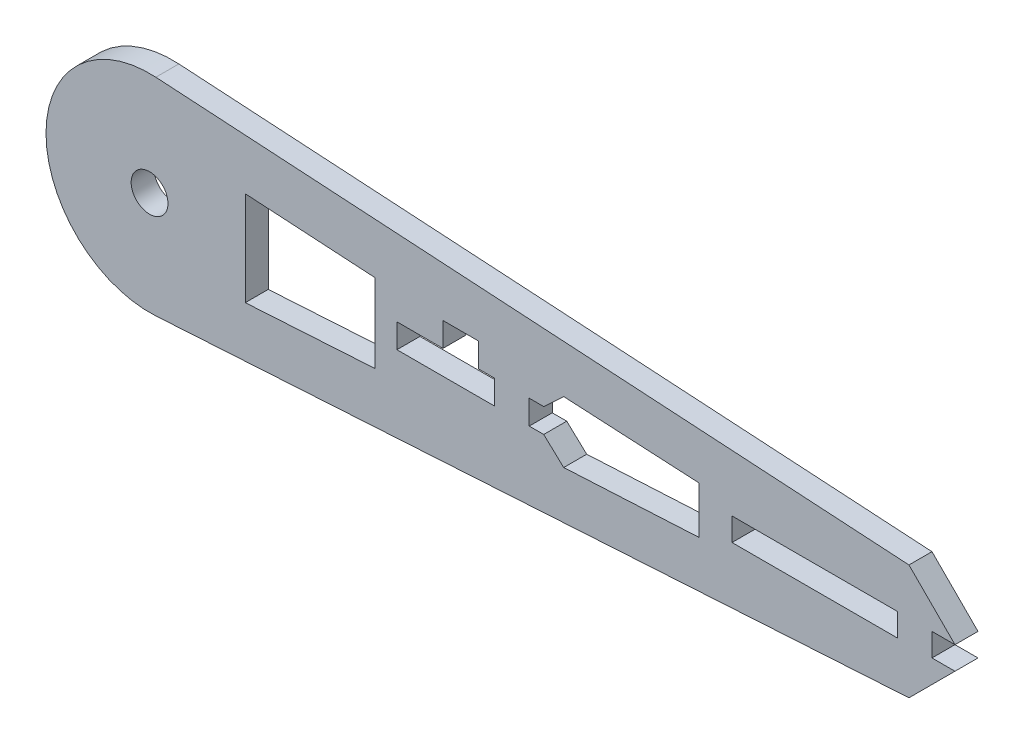
ISO-10303-21;
HEADER;
FILE_DESCRIPTION(('STEP AP214'),'2;1');
FILE_NAME('part.step','',(''),(''),'','','');
FILE_SCHEMA(('AUTOMOTIVE_DESIGN { 1 0 10303 214 1 1 1 1 }'));
ENDSEC;
DATA;
#1=APPLICATION_CONTEXT('core data for automotive mechanical design processes');
#2=APPLICATION_PROTOCOL_DEFINITION('international standard','automotive_design',2000,#1);
#3=PRODUCT_CONTEXT('',#1,'mechanical');
#4=PRODUCT('Part','Part','',(#3));
#5=PRODUCT_RELATED_PRODUCT_CATEGORY('part','',(#4));
#6=PRODUCT_DEFINITION_FORMATION('','',#4);
#7=PRODUCT_DEFINITION_CONTEXT('part definition',#1,'design');
#8=PRODUCT_DEFINITION('design','',#6,#7);
#9=PRODUCT_DEFINITION_SHAPE('','',#8);
#10=(LENGTH_UNIT() NAMED_UNIT(*) SI_UNIT(.MILLI.,.METRE.));
#11=(NAMED_UNIT(*) PLANE_ANGLE_UNIT() SI_UNIT($,.RADIAN.));
#12=(NAMED_UNIT(*) SI_UNIT($,.STERADIAN.) SOLID_ANGLE_UNIT());
#13=UNCERTAINTY_MEASURE_WITH_UNIT(LENGTH_MEASURE(1.E-05),#10,'distance_accuracy_value','');
#14=(GEOMETRIC_REPRESENTATION_CONTEXT(3) GLOBAL_UNCERTAINTY_ASSIGNED_CONTEXT((#13)) GLOBAL_UNIT_ASSIGNED_CONTEXT((#10,
#11,#12)) REPRESENTATION_CONTEXT('',''));
#15=CARTESIAN_POINT('',(0.,0.,0.));
#16=DIRECTION('',(0.,0.,1.));
#17=DIRECTION('',(1.,0.,0.));
#18=AXIS2_PLACEMENT_3D('',#15,#16,#17);
#19=CARTESIAN_POINT('',(0.,0.,2.));
#20=DIRECTION('',(0.,0.,1.));
#21=DIRECTION('',(1.,0.,0.));
#22=AXIS2_PLACEMENT_3D('',#19,#20,#21);
#23=PLANE('',#22);
#24=DIRECTION('',(1.,0.,0.));
#25=VECTOR('',#24,1.);
#26=CARTESIAN_POINT('',(34.2566328302958,-1.05,2.));
#27=LINE('',#26,#25);
#28=CARTESIAN_POINT('',(32.9987597357518,-1.05,2.));
#29=VERTEX_POINT('',#28);
#30=CARTESIAN_POINT('',(34.2566328302958,-1.05,2.));
#31=VERTEX_POINT('',#30);
#32=EDGE_CURVE('E346',#29,#31,#27,.T.);
#33=ORIENTED_EDGE('',*,*,#32,.F.);
#34=DIRECTION('',(0.,-1.,0.));
#35=VECTOR('',#34,1.);
#36=CARTESIAN_POINT('',(32.9987597357518,1.05,2.));
#37=LINE('',#36,#35);
#38=CARTESIAN_POINT('',(32.9987597357518,1.05,2.));
#39=VERTEX_POINT('',#38);
#40=EDGE_CURVE('E344',#39,#29,#37,.T.);
#41=ORIENTED_EDGE('',*,*,#40,.F.);
#42=DIRECTION('',(-1.,0.,0.));
#43=VECTOR('',#42,1.);
#44=CARTESIAN_POINT('',(32.9987597357518,1.05,2.));
#45=LINE('',#44,#43);
#46=CARTESIAN_POINT('',(34.2566328302958,1.05,2.));
#47=VERTEX_POINT('',#46);
#48=EDGE_CURVE('E360',#47,#39,#45,.T.);
#49=ORIENTED_EDGE('',*,*,#48,.F.);
#50=DIRECTION('',(-0.731539799284962,-0.681798740144126,0.));
#51=VECTOR('',#50,1.);
#52=CARTESIAN_POINT('',(35.9939424070578,2.66918118718136,2.));
#53=LINE('',#52,#51);
#54=CARTESIAN_POINT('',(35.9939424070578,2.66918118718136,2.));
#55=VERTEX_POINT('',#54);
#56=EDGE_CURVE('E357',#55,#47,#53,.T.);
#57=ORIENTED_EDGE('',*,*,#56,.F.);
#58=DIRECTION('',(-0.99861639260266,0.0525861238850186,0.));
#59=VECTOR('',#58,1.);
#60=CARTESIAN_POINT('',(35.9939424070578,2.66918118718136,2.));
#61=LINE('',#60,#59);
#62=CARTESIAN_POINT('',(47.7522626221484,2.05000000000001,2.));
#63=VERTEX_POINT('',#62);
#64=EDGE_CURVE('E355',#63,#55,#61,.T.);
#65=ORIENTED_EDGE('',*,*,#64,.F.);
#66=DIRECTION('',(0.,1.,0.));
#67=VECTOR('',#66,1.);
#68=CARTESIAN_POINT('',(47.7522626221484,2.05000000000001,2.));
#69=LINE('',#68,#67);
#70=CARTESIAN_POINT('',(47.7522626221484,-2.05000000000001,2.));
#71=VERTEX_POINT('',#70);
#72=EDGE_CURVE('E353',#71,#63,#69,.T.);
#73=ORIENTED_EDGE('',*,*,#72,.F.);
#74=DIRECTION('',(0.99861639260266,0.0525861238850186,0.));
#75=VECTOR('',#74,1.);
#76=CARTESIAN_POINT('',(47.7522626221484,-2.05000000000001,2.));
#77=LINE('',#76,#75);
#78=CARTESIAN_POINT('',(35.9939424070578,-2.66918118718136,2.));
#79=VERTEX_POINT('',#78);
#80=EDGE_CURVE('E351',#79,#71,#77,.T.);
#81=ORIENTED_EDGE('',*,*,#80,.F.);
#82=DIRECTION('',(0.731539799284962,-0.681798740144126,0.));
#83=VECTOR('',#82,1.);
#84=CARTESIAN_POINT('',(34.2566328302958,-1.05,2.));
#85=LINE('',#84,#83);
#86=EDGE_CURVE('E349',#31,#79,#85,.T.);
#87=ORIENTED_EDGE('',*,*,#86,.F.);
#88=EDGE_LOOP('',(#33,#41,#49,#57,#65,#73,#81,#87));
#89=FACE_BOUND('',#88,.T.);
#90=DIRECTION('',(0.,1.,0.));
#91=VECTOR('',#90,1.);
#92=CARTESIAN_POINT('',(19.5822564197449,3.42036940177537,2.));
#93=LINE('',#92,#91);
#94=CARTESIAN_POINT('',(19.5822564197449,-3.42036940177537,2.));
#95=VERTEX_POINT('',#94);
#96=CARTESIAN_POINT('',(19.5822564197449,3.42036940177537,2.));
#97=VERTEX_POINT('',#96);
#98=EDGE_CURVE('E405',#95,#97,#93,.T.);
#99=ORIENTED_EDGE('',*,*,#98,.F.);
#100=DIRECTION('',(0.998176131716194,0.0603689495692526,0.));
#101=VECTOR('',#100,1.);
#102=CARTESIAN_POINT('',(19.5822564197449,-3.42036940177537,2.));
#103=LINE('',#102,#101);
#104=CARTESIAN_POINT('',(8.31784619558428,-4.10163254877182,2.));
#105=VERTEX_POINT('',#104);
#106=EDGE_CURVE('E403',#105,#95,#103,.T.);
#107=ORIENTED_EDGE('',*,*,#106,.F.);
#108=DIRECTION('',(0.,-1.,0.));
#109=VECTOR('',#108,1.);
#110=CARTESIAN_POINT('',(8.31784619558428,-4.10163254877182,2.));
#111=LINE('',#110,#109);
#112=CARTESIAN_POINT('',(8.31784619558428,4.10163254877182,2.));
#113=VERTEX_POINT('',#112);
#114=EDGE_CURVE('E411',#113,#105,#111,.T.);
#115=ORIENTED_EDGE('',*,*,#114,.F.);
#116=DIRECTION('',(-0.998176131716194,0.0603689495692526,0.));
#117=VECTOR('',#116,1.);
#118=CARTESIAN_POINT('',(8.31784619558428,4.10163254877182,2.));
#119=LINE('',#118,#117);
#120=EDGE_CURVE('E408',#97,#113,#119,.T.);
#121=ORIENTED_EDGE('',*,*,#120,.F.);
#122=EDGE_LOOP('',(#99,#107,#115,#121));
#123=FACE_BOUND('',#122,.T.);
#124=DIRECTION('',(0.,1.,0.));
#125=VECTOR('',#124,1.);
#126=CARTESIAN_POINT('',(68.,-0.999999999999999,2.));
#127=LINE('',#126,#125);
#128=CARTESIAN_POINT('',(68.,-0.999999999999999,2.));
#129=VERTEX_POINT('',#128);
#130=CARTESIAN_POINT('',(68.,0.999999999999999,2.));
#131=VERTEX_POINT('',#130);
#132=EDGE_CURVE('E434',#129,#131,#127,.T.);
#133=ORIENTED_EDGE('',*,*,#132,.T.);
#134=DIRECTION('',(1.,0.,0.));
#135=VECTOR('',#134,1.);
#136=CARTESIAN_POINT('',(68.,0.999999999999999,2.));
#137=LINE('',#136,#135);
#138=CARTESIAN_POINT('',(70.,1.,2.));
#139=VERTEX_POINT('',#138);
#140=EDGE_CURVE('E437',#131,#139,#137,.T.);
#141=ORIENTED_EDGE('',*,*,#140,.T.);
#142=DIRECTION('',(-0.707106781186548,0.707106781186547,0.));
#143=VECTOR('',#142,1.);
#144=CARTESIAN_POINT('',(70.,1.,2.));
#145=LINE('',#144,#143);
#146=CARTESIAN_POINT('',(66.,5.,2.));
#147=VERTEX_POINT('',#146);
#148=EDGE_CURVE('E440',#139,#147,#145,.T.);
#149=ORIENTED_EDGE('',*,*,#148,.T.);
#150=DIRECTION('',(-0.998153258625729,0.0607459652556266,0.));
#151=VECTOR('',#150,1.);
#152=CARTESIAN_POINT('',(66.,5.,2.));
#153=LINE('',#152,#151);
#154=CARTESIAN_POINT('',(0.546713687300639,8.98337932763157,2.));
#155=VERTEX_POINT('',#154);
#156=EDGE_CURVE('E442',#147,#155,#153,.T.);
#157=ORIENTED_EDGE('',*,*,#156,.T.);
#158=CARTESIAN_POINT('',(0.,0.,2.));
#159=DIRECTION('',(0.,0.,1.));
#160=DIRECTION('',(1.,0.,0.));
#161=AXIS2_PLACEMENT_3D('',#158,#159,#160);
#162=CIRCLE('',#161,9.);
#163=CARTESIAN_POINT('',(0.546713687300635,-8.98337932763157,2.));
#164=VERTEX_POINT('',#163);
#165=EDGE_CURVE('E444',#155,#164,#162,.T.);
#166=ORIENTED_EDGE('',*,*,#165,.T.);
#167=DIRECTION('',(0.998153258625729,0.0607459652556266,0.));
#168=VECTOR('',#167,1.);
#169=CARTESIAN_POINT('',(0.546713687300639,-8.98337932763157,2.));
#170=LINE('',#169,#168);
#171=CARTESIAN_POINT('',(66.,-5.,2.));
#172=VERTEX_POINT('',#171);
#173=EDGE_CURVE('E446',#164,#172,#170,.T.);
#174=ORIENTED_EDGE('',*,*,#173,.T.);
#175=DIRECTION('',(0.707106781186548,0.707106781186547,0.));
#176=VECTOR('',#175,1.);
#177=CARTESIAN_POINT('',(66.,-5.,2.));
#178=LINE('',#177,#176);
#179=CARTESIAN_POINT('',(70.,-1.,2.));
#180=VERTEX_POINT('',#179);
#181=EDGE_CURVE('E448',#172,#180,#178,.T.);
#182=ORIENTED_EDGE('',*,*,#181,.T.);
#183=DIRECTION('',(-1.,0.,0.));
#184=VECTOR('',#183,1.);
#185=CARTESIAN_POINT('',(70.,-1.,2.));
#186=LINE('',#185,#184);
#187=EDGE_CURVE('E450',#180,#129,#186,.T.);
#188=ORIENTED_EDGE('',*,*,#187,.T.);
#189=EDGE_LOOP('',(#133,#141,#149,#157,#166,#174,#182,#188));
#190=FACE_BOUND('',#189,.T.);
#191=CARTESIAN_POINT('',(0.,0.,2.));
#192=DIRECTION('',(0.,0.,1.));
#193=DIRECTION('',(1.,0.,0.));
#194=AXIS2_PLACEMENT_3D('',#191,#192,#193);
#195=CIRCLE('',#194,1.6);
#196=CARTESIAN_POINT('',(1.6,0.,2.));
#197=VERTEX_POINT('',#196);
#198=EDGE_CURVE('E338',#197,#197,#195,.T.);
#199=ORIENTED_EDGE('',*,*,#198,.F.);
#200=EDGE_LOOP('',(#199));
#201=FACE_BOUND('',#200,.T.);
#202=DIRECTION('',(0.,-1.,0.));
#203=VECTOR('',#202,1.);
#204=CARTESIAN_POINT('',(25.5,3.15,2.));
#205=LINE('',#204,#203);
#206=CARTESIAN_POINT('',(25.5,3.15,2.));
#207=VERTEX_POINT('',#206);
#208=CARTESIAN_POINT('',(25.5,1.05,2.));
#209=VERTEX_POINT('',#208);
#210=EDGE_CURVE('E281',#207,#209,#205,.T.);
#211=ORIENTED_EDGE('',*,*,#210,.F.);
#212=DIRECTION('',(-1.,0.,0.));
#213=VECTOR('',#212,1.);
#214=CARTESIAN_POINT('',(28.6,3.15,2.));
#215=LINE('',#214,#213);
#216=CARTESIAN_POINT('',(28.6,3.15,2.));
#217=VERTEX_POINT('',#216);
#218=EDGE_CURVE('E279',#217,#207,#215,.T.);
#219=ORIENTED_EDGE('',*,*,#218,.F.);
#220=DIRECTION('',(0.,1.,0.));
#221=VECTOR('',#220,1.);
#222=CARTESIAN_POINT('',(28.6,1.05,2.));
#223=LINE('',#222,#221);
#224=CARTESIAN_POINT('',(28.6,1.05,2.));
#225=VERTEX_POINT('',#224);
#226=EDGE_CURVE('E295',#225,#217,#223,.T.);
#227=ORIENTED_EDGE('',*,*,#226,.F.);
#228=DIRECTION('',(-1.,0.,0.));
#229=VECTOR('',#228,1.);
#230=CARTESIAN_POINT('',(30.,1.05,2.));
#231=LINE('',#230,#229);
#232=CARTESIAN_POINT('',(30.,1.05,2.));
#233=VERTEX_POINT('',#232);
#234=EDGE_CURVE('E292',#233,#225,#231,.T.);
#235=ORIENTED_EDGE('',*,*,#234,.F.);
#236=DIRECTION('',(0.,1.,0.));
#237=VECTOR('',#236,1.);
#238=CARTESIAN_POINT('',(30.,1.05,2.));
#239=LINE('',#238,#237);
#240=CARTESIAN_POINT('',(30.,-1.05,2.));
#241=VERTEX_POINT('',#240);
#242=EDGE_CURVE('E290',#241,#233,#239,.T.);
#243=ORIENTED_EDGE('',*,*,#242,.F.);
#244=DIRECTION('',(1.,0.,0.));
#245=VECTOR('',#244,1.);
#246=CARTESIAN_POINT('',(21.5,-1.05,2.));
#247=LINE('',#246,#245);
#248=CARTESIAN_POINT('',(21.5,-1.05,2.));
#249=VERTEX_POINT('',#248);
#250=EDGE_CURVE('E288',#249,#241,#247,.T.);
#251=ORIENTED_EDGE('',*,*,#250,.F.);
#252=DIRECTION('',(0.,-1.,0.));
#253=VECTOR('',#252,1.);
#254=CARTESIAN_POINT('',(21.5,1.05,2.));
#255=LINE('',#254,#253);
#256=CARTESIAN_POINT('',(21.5,1.05,2.));
#257=VERTEX_POINT('',#256);
#258=EDGE_CURVE('E286',#257,#249,#255,.T.);
#259=ORIENTED_EDGE('',*,*,#258,.F.);
#260=DIRECTION('',(-1.,0.,0.));
#261=VECTOR('',#260,1.);
#262=CARTESIAN_POINT('',(25.5,1.05,2.));
#263=LINE('',#262,#261);
#264=EDGE_CURVE('E284',#209,#257,#263,.T.);
#265=ORIENTED_EDGE('',*,*,#264,.F.);
#266=EDGE_LOOP('',(#211,#219,#227,#235,#243,#251,#259,#265));
#267=FACE_BOUND('',#266,.T.);
#268=DIRECTION('',(0.,-1.,0.));
#269=VECTOR('',#268,1.);
#270=CARTESIAN_POINT('',(50.6220379790243,-1.,2.));
#271=LINE('',#270,#269);
#272=CARTESIAN_POINT('',(50.6220379790243,1.,2.));
#273=VERTEX_POINT('',#272);
#274=CARTESIAN_POINT('',(50.6220379790243,-1.,2.));
#275=VERTEX_POINT('',#274);
#276=EDGE_CURVE('E251',#273,#275,#271,.T.);
#277=ORIENTED_EDGE('',*,*,#276,.F.);
#278=DIRECTION('',(-1.,0.,0.));
#279=VECTOR('',#278,1.);
#280=CARTESIAN_POINT('',(50.6220379790243,1.,2.));
#281=LINE('',#280,#279);
#282=CARTESIAN_POINT('',(65.,0.999999999999999,2.));
#283=VERTEX_POINT('',#282);
#284=EDGE_CURVE('E243',#283,#273,#281,.T.);
#285=ORIENTED_EDGE('',*,*,#284,.F.);
#286=DIRECTION('',(0.,1.,0.));
#287=VECTOR('',#286,1.);
#288=CARTESIAN_POINT('',(65.,0.999999999999999,2.));
#289=LINE('',#288,#287);
#290=CARTESIAN_POINT('',(65.,-0.999999999999999,2.));
#291=VERTEX_POINT('',#290);
#292=EDGE_CURVE('E265',#291,#283,#289,.T.);
#293=ORIENTED_EDGE('',*,*,#292,.F.);
#294=DIRECTION('',(1.,0.,0.));
#295=VECTOR('',#294,1.);
#296=CARTESIAN_POINT('',(65.,-0.999999999999999,2.));
#297=LINE('',#296,#295);
#298=EDGE_CURVE('E263',#275,#291,#297,.T.);
#299=ORIENTED_EDGE('',*,*,#298,.F.);
#300=EDGE_LOOP('',(#277,#285,#293,#299));
#301=FACE_BOUND('',#300,.T.);
#302=ADVANCED_FACE('F34',(#89,#123,#190,#201,#267,#301),#23,.T.);
#303=CARTESIAN_POINT('',(0.,0.,0.));
#304=DIRECTION('',(0.,0.,1.));
#305=DIRECTION('',(1.,0.,0.));
#306=AXIS2_PLACEMENT_3D('',#303,#304,#305);
#307=PLANE('',#306);
#308=DIRECTION('',(-1.,0.,0.));
#309=VECTOR('',#308,1.);
#310=CARTESIAN_POINT('',(28.6,3.15,0.));
#311=LINE('',#310,#309);
#312=CARTESIAN_POINT('',(28.6,3.15,0.));
#313=VERTEX_POINT('',#312);
#314=CARTESIAN_POINT('',(25.5,3.15,0.));
#315=VERTEX_POINT('',#314);
#316=EDGE_CURVE('E259',#313,#315,#311,.T.);
#317=ORIENTED_EDGE('',*,*,#316,.T.);
#318=DIRECTION('',(0.,-1.,0.));
#319=VECTOR('',#318,1.);
#320=CARTESIAN_POINT('',(25.5,3.15,0.));
#321=LINE('',#320,#319);
#322=CARTESIAN_POINT('',(25.5,1.05,0.));
#323=VERTEX_POINT('',#322);
#324=EDGE_CURVE('E300',#315,#323,#321,.T.);
#325=ORIENTED_EDGE('',*,*,#324,.T.);
#326=DIRECTION('',(-1.,0.,0.));
#327=VECTOR('',#326,1.);
#328=CARTESIAN_POINT('',(25.5,1.05,0.));
#329=LINE('',#328,#327);
#330=CARTESIAN_POINT('',(21.5,1.05,0.));
#331=VERTEX_POINT('',#330);
#332=EDGE_CURVE('E303',#323,#331,#329,.T.);
#333=ORIENTED_EDGE('',*,*,#332,.T.);
#334=DIRECTION('',(0.,-1.,0.));
#335=VECTOR('',#334,1.);
#336=CARTESIAN_POINT('',(21.5,1.05,0.));
#337=LINE('',#336,#335);
#338=CARTESIAN_POINT('',(21.5,-1.05,0.));
#339=VERTEX_POINT('',#338);
#340=EDGE_CURVE('E306',#331,#339,#337,.T.);
#341=ORIENTED_EDGE('',*,*,#340,.T.);
#342=DIRECTION('',(1.,0.,0.));
#343=VECTOR('',#342,1.);
#344=CARTESIAN_POINT('',(21.5,-1.05,0.));
#345=LINE('',#344,#343);
#346=CARTESIAN_POINT('',(30.,-1.05,0.));
#347=VERTEX_POINT('',#346);
#348=EDGE_CURVE('E309',#339,#347,#345,.T.);
#349=ORIENTED_EDGE('',*,*,#348,.T.);
#350=DIRECTION('',(0.,1.,0.));
#351=VECTOR('',#350,1.);
#352=CARTESIAN_POINT('',(30.,1.05,0.));
#353=LINE('',#352,#351);
#354=CARTESIAN_POINT('',(30.,1.05,0.));
#355=VERTEX_POINT('',#354);
#356=EDGE_CURVE('E312',#347,#355,#353,.T.);
#357=ORIENTED_EDGE('',*,*,#356,.T.);
#358=DIRECTION('',(-1.,0.,0.));
#359=VECTOR('',#358,1.);
#360=CARTESIAN_POINT('',(30.,1.05,0.));
#361=LINE('',#360,#359);
#362=CARTESIAN_POINT('',(28.6,1.05,0.));
#363=VERTEX_POINT('',#362);
#364=EDGE_CURVE('E315',#355,#363,#361,.T.);
#365=ORIENTED_EDGE('',*,*,#364,.T.);
#366=DIRECTION('',(0.,1.,0.));
#367=VECTOR('',#366,1.);
#368=CARTESIAN_POINT('',(28.6,1.05,0.));
#369=LINE('',#368,#367);
#370=EDGE_CURVE('E282',#363,#313,#369,.T.);
#371=ORIENTED_EDGE('',*,*,#370,.T.);
#372=EDGE_LOOP('',(#317,#325,#333,#341,#349,#357,#365,#371));
#373=FACE_BOUND('',#372,.T.);
#374=DIRECTION('',(0.998176131716194,0.0603689495692526,0.));
#375=VECTOR('',#374,1.);
#376=CARTESIAN_POINT('',(19.5822564197449,-3.42036940177537,0.));
#377=LINE('',#376,#375);
#378=CARTESIAN_POINT('',(8.31784619558428,-4.10163254877182,0.));
#379=VERTEX_POINT('',#378);
#380=CARTESIAN_POINT('',(19.5822564197449,-3.42036940177537,0.));
#381=VERTEX_POINT('',#380);
#382=EDGE_CURVE('E402',#379,#381,#377,.T.);
#383=ORIENTED_EDGE('',*,*,#382,.T.);
#384=DIRECTION('',(0.,1.,0.));
#385=VECTOR('',#384,1.);
#386=CARTESIAN_POINT('',(19.5822564197449,3.42036940177537,0.));
#387=LINE('',#386,#385);
#388=CARTESIAN_POINT('',(19.5822564197449,3.42036940177537,0.));
#389=VERTEX_POINT('',#388);
#390=EDGE_CURVE('E416',#381,#389,#387,.T.);
#391=ORIENTED_EDGE('',*,*,#390,.T.);
#392=DIRECTION('',(-0.998176131716194,0.0603689495692526,0.));
#393=VECTOR('',#392,1.);
#394=CARTESIAN_POINT('',(8.31784619558428,4.10163254877182,0.));
#395=LINE('',#394,#393);
#396=CARTESIAN_POINT('',(8.31784619558428,4.10163254877182,0.));
#397=VERTEX_POINT('',#396);
#398=EDGE_CURVE('E419',#389,#397,#395,.T.);
#399=ORIENTED_EDGE('',*,*,#398,.T.);
#400=DIRECTION('',(0.,-1.,0.));
#401=VECTOR('',#400,1.);
#402=CARTESIAN_POINT('',(8.31784619558428,-4.10163254877182,0.));
#403=LINE('',#402,#401);
#404=EDGE_CURVE('E406',#397,#379,#403,.T.);
#405=ORIENTED_EDGE('',*,*,#404,.T.);
#406=EDGE_LOOP('',(#383,#391,#399,#405));
#407=FACE_BOUND('',#406,.T.);
#408=DIRECTION('',(0.,1.,0.));
#409=VECTOR('',#408,1.);
#410=CARTESIAN_POINT('',(68.,-0.999999999999999,0.));
#411=LINE('',#410,#409);
#412=CARTESIAN_POINT('',(68.,-0.999999999999999,0.));
#413=VERTEX_POINT('',#412);
#414=CARTESIAN_POINT('',(68.,0.999999999999999,0.));
#415=VERTEX_POINT('',#414);
#416=EDGE_CURVE('E433',#413,#415,#411,.T.);
#417=ORIENTED_EDGE('',*,*,#416,.F.);
#418=DIRECTION('',(-1.,0.,0.));
#419=VECTOR('',#418,1.);
#420=CARTESIAN_POINT('',(70.,-1.,0.));
#421=LINE('',#420,#419);
#422=CARTESIAN_POINT('',(70.,-1.,0.));
#423=VERTEX_POINT('',#422);
#424=EDGE_CURVE('E438',#423,#413,#421,.T.);
#425=ORIENTED_EDGE('',*,*,#424,.F.);
#426=DIRECTION('',(0.707106781186548,0.707106781186547,0.));
#427=VECTOR('',#426,1.);
#428=CARTESIAN_POINT('',(66.,-5.,0.));
#429=LINE('',#428,#427);
#430=CARTESIAN_POINT('',(66.,-5.,0.));
#431=VERTEX_POINT('',#430);
#432=EDGE_CURVE('E465',#431,#423,#429,.T.);
#433=ORIENTED_EDGE('',*,*,#432,.F.);
#434=DIRECTION('',(0.998153258625729,0.0607459652556266,0.));
#435=VECTOR('',#434,1.);
#436=CARTESIAN_POINT('',(0.546713687300639,-8.98337932763157,0.));
#437=LINE('',#436,#435);
#438=CARTESIAN_POINT('',(0.546713687300635,-8.98337932763157,0.));
#439=VERTEX_POINT('',#438);
#440=EDGE_CURVE('E463',#439,#431,#437,.T.);
#441=ORIENTED_EDGE('',*,*,#440,.F.);
#442=CARTESIAN_POINT('',(0.,0.,0.));
#443=DIRECTION('',(0.,0.,1.));
#444=DIRECTION('',(1.,0.,0.));
#445=AXIS2_PLACEMENT_3D('',#442,#443,#444);
#446=CIRCLE('',#445,9.);
#447=CARTESIAN_POINT('',(0.546713687300639,8.98337932763157,0.));
#448=VERTEX_POINT('',#447);
#449=EDGE_CURVE('E461',#448,#439,#446,.T.);
#450=ORIENTED_EDGE('',*,*,#449,.F.);
#451=DIRECTION('',(-0.998153258625729,0.0607459652556266,0.));
#452=VECTOR('',#451,1.);
#453=CARTESIAN_POINT('',(66.,5.,0.));
#454=LINE('',#453,#452);
#455=CARTESIAN_POINT('',(66.,5.,0.));
#456=VERTEX_POINT('',#455);
#457=EDGE_CURVE('E459',#456,#448,#454,.T.);
#458=ORIENTED_EDGE('',*,*,#457,.F.);
#459=DIRECTION('',(-0.707106781186548,0.707106781186547,0.));
#460=VECTOR('',#459,1.);
#461=CARTESIAN_POINT('',(70.,1.,0.));
#462=LINE('',#461,#460);
#463=CARTESIAN_POINT('',(70.,1.,0.));
#464=VERTEX_POINT('',#463);
#465=EDGE_CURVE('E457',#464,#456,#462,.T.);
#466=ORIENTED_EDGE('',*,*,#465,.F.);
#467=DIRECTION('',(1.,0.,0.));
#468=VECTOR('',#467,1.);
#469=CARTESIAN_POINT('',(68.,0.999999999999999,0.));
#470=LINE('',#469,#468);
#471=EDGE_CURVE('E455',#415,#464,#470,.T.);
#472=ORIENTED_EDGE('',*,*,#471,.F.);
#473=EDGE_LOOP('',(#417,#425,#433,#441,#450,#458,#466,#472));
#474=FACE_BOUND('',#473,.T.);
#475=DIRECTION('',(0.,-1.,0.));
#476=VECTOR('',#475,1.);
#477=CARTESIAN_POINT('',(32.9987597357518,1.05,0.));
#478=LINE('',#477,#476);
#479=CARTESIAN_POINT('',(32.9987597357518,1.05,0.));
#480=VERTEX_POINT('',#479);
#481=CARTESIAN_POINT('',(32.9987597357518,-1.05,0.));
#482=VERTEX_POINT('',#481);
#483=EDGE_CURVE('E341',#480,#482,#478,.T.);
#484=ORIENTED_EDGE('',*,*,#483,.T.);
#485=DIRECTION('',(1.,0.,0.));
#486=VECTOR('',#485,1.);
#487=CARTESIAN_POINT('',(34.2566328302958,-1.05,0.));
#488=LINE('',#487,#486);
#489=CARTESIAN_POINT('',(34.2566328302958,-1.05,0.));
#490=VERTEX_POINT('',#489);
#491=EDGE_CURVE('E365',#482,#490,#488,.T.);
#492=ORIENTED_EDGE('',*,*,#491,.T.);
#493=DIRECTION('',(0.731539799284962,-0.681798740144126,0.));
#494=VECTOR('',#493,1.);
#495=CARTESIAN_POINT('',(34.2566328302958,-1.05,0.));
#496=LINE('',#495,#494);
#497=CARTESIAN_POINT('',(35.9939424070578,-2.66918118718136,0.));
#498=VERTEX_POINT('',#497);
#499=EDGE_CURVE('E368',#490,#498,#496,.T.);
#500=ORIENTED_EDGE('',*,*,#499,.T.);
#501=DIRECTION('',(0.99861639260266,0.0525861238850186,0.));
#502=VECTOR('',#501,1.);
#503=CARTESIAN_POINT('',(47.7522626221484,-2.05000000000001,0.));
#504=LINE('',#503,#502);
#505=CARTESIAN_POINT('',(47.7522626221484,-2.05000000000001,0.));
#506=VERTEX_POINT('',#505);
#507=EDGE_CURVE('E371',#498,#506,#504,.T.);
#508=ORIENTED_EDGE('',*,*,#507,.T.);
#509=DIRECTION('',(0.,1.,0.));
#510=VECTOR('',#509,1.);
#511=CARTESIAN_POINT('',(47.7522626221484,2.05000000000001,0.));
#512=LINE('',#511,#510);
#513=CARTESIAN_POINT('',(47.7522626221484,2.05000000000001,0.));
#514=VERTEX_POINT('',#513);
#515=EDGE_CURVE('E374',#506,#514,#512,.T.);
#516=ORIENTED_EDGE('',*,*,#515,.T.);
#517=DIRECTION('',(-0.99861639260266,0.0525861238850186,0.));
#518=VECTOR('',#517,1.);
#519=CARTESIAN_POINT('',(35.9939424070578,2.66918118718136,0.));
#520=LINE('',#519,#518);
#521=CARTESIAN_POINT('',(35.9939424070578,2.66918118718136,0.));
#522=VERTEX_POINT('',#521);
#523=EDGE_CURVE('E377',#514,#522,#520,.T.);
#524=ORIENTED_EDGE('',*,*,#523,.T.);
#525=DIRECTION('',(-0.731539799284962,-0.681798740144126,0.));
#526=VECTOR('',#525,1.);
#527=CARTESIAN_POINT('',(35.9939424070578,2.66918118718136,0.));
#528=LINE('',#527,#526);
#529=CARTESIAN_POINT('',(34.2566328302958,1.05,0.));
#530=VERTEX_POINT('',#529);
#531=EDGE_CURVE('E380',#522,#530,#528,.T.);
#532=ORIENTED_EDGE('',*,*,#531,.T.);
#533=DIRECTION('',(-1.,0.,0.));
#534=VECTOR('',#533,1.);
#535=CARTESIAN_POINT('',(32.9987597357518,1.05,0.));
#536=LINE('',#535,#534);
#537=EDGE_CURVE('E347',#530,#480,#536,.T.);
#538=ORIENTED_EDGE('',*,*,#537,.T.);
#539=EDGE_LOOP('',(#484,#492,#500,#508,#516,#524,#532,#538));
#540=FACE_BOUND('',#539,.T.);
#541=CARTESIAN_POINT('',(0.,0.,0.));
#542=DIRECTION('',(0.,0.,1.));
#543=DIRECTION('',(1.,0.,0.));
#544=AXIS2_PLACEMENT_3D('',#541,#542,#543);
#545=CIRCLE('',#544,1.6);
#546=CARTESIAN_POINT('',(1.6,0.,0.));
#547=VERTEX_POINT('',#546);
#548=EDGE_CURVE('E337',#547,#547,#545,.T.);
#549=ORIENTED_EDGE('',*,*,#548,.T.);
#550=EDGE_LOOP('',(#549));
#551=FACE_BOUND('',#550,.T.);
#552=DIRECTION('',(-1.,0.,0.));
#553=VECTOR('',#552,1.);
#554=CARTESIAN_POINT('',(50.6220379790243,1.,0.));
#555=LINE('',#554,#553);
#556=CARTESIAN_POINT('',(65.,0.999999999999999,0.));
#557=VERTEX_POINT('',#556);
#558=CARTESIAN_POINT('',(50.6220379790243,1.,0.));
#559=VERTEX_POINT('',#558);
#560=EDGE_CURVE('E57',#557,#559,#555,.T.);
#561=ORIENTED_EDGE('',*,*,#560,.T.);
#562=DIRECTION('',(0.,-1.,0.));
#563=VECTOR('',#562,1.);
#564=CARTESIAN_POINT('',(50.6220379790243,-1.,0.));
#565=LINE('',#564,#563);
#566=CARTESIAN_POINT('',(50.6220379790243,-1.,0.));
#567=VERTEX_POINT('',#566);
#568=EDGE_CURVE('E258',#559,#567,#565,.T.);
#569=ORIENTED_EDGE('',*,*,#568,.T.);
#570=DIRECTION('',(1.,0.,0.));
#571=VECTOR('',#570,1.);
#572=CARTESIAN_POINT('',(65.,-0.999999999999999,0.));
#573=LINE('',#572,#571);
#574=CARTESIAN_POINT('',(65.,-0.999999999999999,0.));
#575=VERTEX_POINT('',#574);
#576=EDGE_CURVE('E271',#567,#575,#573,.T.);
#577=ORIENTED_EDGE('',*,*,#576,.T.);
#578=DIRECTION('',(0.,1.,0.));
#579=VECTOR('',#578,1.);
#580=CARTESIAN_POINT('',(65.,0.999999999999999,0.));
#581=LINE('',#580,#579);
#582=EDGE_CURVE('E252',#575,#557,#581,.T.);
#583=ORIENTED_EDGE('',*,*,#582,.T.);
#584=EDGE_LOOP('',(#561,#569,#577,#583));
#585=FACE_BOUND('',#584,.T.);
#586=ADVANCED_FACE('F495',(#373,#407,#474,#540,#551,#585),#307,.F.);
#587=CARTESIAN_POINT('',(68.,-0.999999999999999,2.));
#588=DIRECTION('',(-1.,0.,0.));
#589=DIRECTION('',(0.,0.,1.));
#590=AXIS2_PLACEMENT_3D('',#587,#588,#589);
#591=PLANE('',#590);
#592=ORIENTED_EDGE('',*,*,#416,.T.);
#593=DIRECTION('',(0.,0.,-1.));
#594=VECTOR('',#593,1.);
#595=CARTESIAN_POINT('',(68.,0.999999999999999,2.));
#596=LINE('',#595,#594);
#597=EDGE_CURVE('E11',#131,#415,#596,.T.);
#598=ORIENTED_EDGE('',*,*,#597,.F.);
#599=ORIENTED_EDGE('',*,*,#132,.F.);
#600=DIRECTION('',(0.,0.,-1.));
#601=VECTOR('',#600,1.);
#602=CARTESIAN_POINT('',(68.,-0.999999999999999,2.));
#603=LINE('',#602,#601);
#604=EDGE_CURVE('E452',#129,#413,#603,.T.);
#605=ORIENTED_EDGE('',*,*,#604,.T.);
#606=EDGE_LOOP('',(#592,#598,#599,#605));
#607=FACE_BOUND('',#606,.T.);
#608=ADVANCED_FACE('F36',(#607),#591,.F.);
#609=CARTESIAN_POINT('',(68.,0.999999999999999,2.));
#610=DIRECTION('',(0.,1.,0.));
#611=DIRECTION('',(-1.,0.,0.));
#612=AXIS2_PLACEMENT_3D('',#609,#610,#611);
#613=PLANE('',#612);
#614=ORIENTED_EDGE('',*,*,#471,.T.);
#615=DIRECTION('',(0.,0.,-1.));
#616=VECTOR('',#615,1.);
#617=CARTESIAN_POINT('',(70.,1.,2.));
#618=LINE('',#617,#616);
#619=EDGE_CURVE('E42',#139,#464,#618,.T.);
#620=ORIENTED_EDGE('',*,*,#619,.F.);
#621=ORIENTED_EDGE('',*,*,#140,.F.);
#622=ORIENTED_EDGE('',*,*,#597,.T.);
#623=EDGE_LOOP('',(#614,#620,#621,#622));
#624=FACE_BOUND('',#623,.T.);
#625=ADVANCED_FACE('F513',(#624),#613,.F.);
#626=CARTESIAN_POINT('',(70.,1.,2.));
#627=DIRECTION('',(-0.707106781186547,-0.707106781186548,0.));
#628=DIRECTION('',(0.707106781186548,-0.707106781186547,0.));
#629=AXIS2_PLACEMENT_3D('',#626,#627,#628);
#630=PLANE('',#629);
#631=ORIENTED_EDGE('',*,*,#465,.T.);
#632=DIRECTION('',(0.,0.,-1.));
#633=VECTOR('',#632,1.);
#634=CARTESIAN_POINT('',(66.,5.,2.));
#635=LINE('',#634,#633);
#636=EDGE_CURVE('E482',#147,#456,#635,.T.);
#637=ORIENTED_EDGE('',*,*,#636,.F.);
#638=ORIENTED_EDGE('',*,*,#148,.F.);
#639=ORIENTED_EDGE('',*,*,#619,.T.);
#640=EDGE_LOOP('',(#631,#637,#638,#639));
#641=FACE_BOUND('',#640,.T.);
#642=ADVANCED_FACE('F489',(#641),#630,.F.);
#643=CARTESIAN_POINT('',(66.,5.,2.));
#644=DIRECTION('',(-0.0607459652556266,-0.998153258625729,0.));
#645=DIRECTION('',(0.998153258625729,-0.0607459652556266,0.));
#646=AXIS2_PLACEMENT_3D('',#643,#644,#645);
#647=PLANE('',#646);
#648=ORIENTED_EDGE('',*,*,#457,.T.);
#649=DIRECTION('',(0.,0.,-1.));
#650=VECTOR('',#649,1.);
#651=CARTESIAN_POINT('',(0.546713687300639,8.98337932763157,2.));
#652=LINE('',#651,#650);
#653=EDGE_CURVE('E479',#155,#448,#652,.T.);
#654=ORIENTED_EDGE('',*,*,#653,.F.);
#655=ORIENTED_EDGE('',*,*,#156,.F.);
#656=ORIENTED_EDGE('',*,*,#636,.T.);
#657=EDGE_LOOP('',(#648,#654,#655,#656));
#658=FACE_BOUND('',#657,.T.);
#659=ADVANCED_FACE('F501',(#658),#647,.F.);
#660=CARTESIAN_POINT('',(0.,0.,2.));
#661=DIRECTION('',(0.,0.,-1.));
#662=DIRECTION('',(-1.,0.,0.));
#663=AXIS2_PLACEMENT_3D('',#660,#661,#662);
#664=CYLINDRICAL_SURFACE('',#663,9.);
#665=ORIENTED_EDGE('',*,*,#449,.T.);
#666=DIRECTION('',(0.,0.,-1.));
#667=VECTOR('',#666,1.);
#668=CARTESIAN_POINT('',(0.546713687300635,-8.98337932763157,2.));
#669=LINE('',#668,#667);
#670=EDGE_CURVE('E476',#164,#439,#669,.T.);
#671=ORIENTED_EDGE('',*,*,#670,.F.);
#672=ORIENTED_EDGE('',*,*,#165,.F.);
#673=ORIENTED_EDGE('',*,*,#653,.T.);
#674=EDGE_LOOP('',(#665,#671,#672,#673));
#675=FACE_BOUND('',#674,.T.);
#676=ADVANCED_FACE('F505',(#675),#664,.T.);
#677=CARTESIAN_POINT('',(0.546713687300639,-8.98337932763157,2.));
#678=DIRECTION('',(-0.0607459652556266,0.998153258625729,0.));
#679=DIRECTION('',(-0.998153258625729,-0.0607459652556266,0.));
#680=AXIS2_PLACEMENT_3D('',#677,#678,#679);
#681=PLANE('',#680);
#682=ORIENTED_EDGE('',*,*,#440,.T.);
#683=DIRECTION('',(0.,0.,-1.));
#684=VECTOR('',#683,1.);
#685=CARTESIAN_POINT('',(66.,-5.,2.));
#686=LINE('',#685,#684);
#687=EDGE_CURVE('E473',#172,#431,#686,.T.);
#688=ORIENTED_EDGE('',*,*,#687,.F.);
#689=ORIENTED_EDGE('',*,*,#173,.F.);
#690=ORIENTED_EDGE('',*,*,#670,.T.);
#691=EDGE_LOOP('',(#682,#688,#689,#690));
#692=FACE_BOUND('',#691,.T.);
#693=ADVANCED_FACE('F526',(#692),#681,.F.);
#694=CARTESIAN_POINT('',(66.,-5.,2.));
#695=DIRECTION('',(-0.707106781186547,0.707106781186548,0.));
#696=DIRECTION('',(-0.707106781186548,-0.707106781186547,0.));
#697=AXIS2_PLACEMENT_3D('',#694,#695,#696);
#698=PLANE('',#697);
#699=ORIENTED_EDGE('',*,*,#432,.T.);
#700=DIRECTION('',(0.,0.,-1.));
#701=VECTOR('',#700,1.);
#702=CARTESIAN_POINT('',(70.,-1.,2.));
#703=LINE('',#702,#701);
#704=EDGE_CURVE('E470',#180,#423,#703,.T.);
#705=ORIENTED_EDGE('',*,*,#704,.F.);
#706=ORIENTED_EDGE('',*,*,#181,.F.);
#707=ORIENTED_EDGE('',*,*,#687,.T.);
#708=EDGE_LOOP('',(#699,#705,#706,#707));
#709=FACE_BOUND('',#708,.T.);
#710=ADVANCED_FACE('F524',(#709),#698,.F.);
#711=CARTESIAN_POINT('',(70.,-1.,2.));
#712=DIRECTION('',(0.,-1.,0.));
#713=DIRECTION('',(1.,0.,0.));
#714=AXIS2_PLACEMENT_3D('',#711,#712,#713);
#715=PLANE('',#714);
#716=ORIENTED_EDGE('',*,*,#424,.T.);
#717=ORIENTED_EDGE('',*,*,#604,.F.);
#718=ORIENTED_EDGE('',*,*,#187,.F.);
#719=ORIENTED_EDGE('',*,*,#704,.T.);
#720=EDGE_LOOP('',(#716,#717,#718,#719));
#721=FACE_BOUND('',#720,.T.);
#722=ADVANCED_FACE('F519',(#721),#715,.F.);
#723=CARTESIAN_POINT('',(19.5822564197449,-3.42036940177537,2.));
#724=DIRECTION('',(-0.0603689495692526,0.998176131716194,0.));
#725=DIRECTION('',(-0.998176131716194,-0.0603689495692526,0.));
#726=AXIS2_PLACEMENT_3D('',#723,#724,#725);
#727=PLANE('',#726);
#728=ORIENTED_EDGE('',*,*,#382,.F.);
#729=DIRECTION('',(0.,0.,-1.));
#730=VECTOR('',#729,1.);
#731=CARTESIAN_POINT('',(8.31784619558428,-4.10163254877182,2.));
#732=LINE('',#731,#730);
#733=EDGE_CURVE('E413',#105,#379,#732,.T.);
#734=ORIENTED_EDGE('',*,*,#733,.F.);
#735=ORIENTED_EDGE('',*,*,#106,.T.);
#736=DIRECTION('',(0.,0.,-1.));
#737=VECTOR('',#736,1.);
#738=CARTESIAN_POINT('',(19.5822564197449,-3.42036940177537,2.));
#739=LINE('',#738,#737);
#740=EDGE_CURVE('E430',#95,#381,#739,.T.);
#741=ORIENTED_EDGE('',*,*,#740,.T.);
#742=EDGE_LOOP('',(#728,#734,#735,#741));
#743=FACE_BOUND('',#742,.T.);
#744=ADVANCED_FACE('F546',(#743),#727,.T.);
#745=CARTESIAN_POINT('',(19.5822564197449,3.42036940177537,2.));
#746=DIRECTION('',(-1.,0.,0.));
#747=DIRECTION('',(0.,0.,1.));
#748=AXIS2_PLACEMENT_3D('',#745,#746,#747);
#749=PLANE('',#748);
#750=ORIENTED_EDGE('',*,*,#390,.F.);
#751=ORIENTED_EDGE('',*,*,#740,.F.);
#752=ORIENTED_EDGE('',*,*,#98,.T.);
#753=DIRECTION('',(0.,0.,-1.));
#754=VECTOR('',#753,1.);
#755=CARTESIAN_POINT('',(19.5822564197449,3.42036940177537,2.));
#756=LINE('',#755,#754);
#757=EDGE_CURVE('E428',#97,#389,#756,.T.);
#758=ORIENTED_EDGE('',*,*,#757,.T.);
#759=EDGE_LOOP('',(#750,#751,#752,#758));
#760=FACE_BOUND('',#759,.T.);
#761=ADVANCED_FACE('F553',(#760),#749,.T.);
#762=CARTESIAN_POINT('',(8.31784619558428,4.10163254877182,2.));
#763=DIRECTION('',(-0.0603689495692526,-0.998176131716194,0.));
#764=DIRECTION('',(0.998176131716194,-0.0603689495692526,0.));
#765=AXIS2_PLACEMENT_3D('',#762,#763,#764);
#766=PLANE('',#765);
#767=ORIENTED_EDGE('',*,*,#398,.F.);
#768=ORIENTED_EDGE('',*,*,#757,.F.);
#769=ORIENTED_EDGE('',*,*,#120,.T.);
#770=DIRECTION('',(0.,0.,-1.));
#771=VECTOR('',#770,1.);
#772=CARTESIAN_POINT('',(8.31784619558428,4.10163254877182,2.));
#773=LINE('',#772,#771);
#774=EDGE_CURVE('E426',#113,#397,#773,.T.);
#775=ORIENTED_EDGE('',*,*,#774,.T.);
#776=EDGE_LOOP('',(#767,#768,#769,#775));
#777=FACE_BOUND('',#776,.T.);
#778=ADVANCED_FACE('F558',(#777),#766,.T.);
#779=CARTESIAN_POINT('',(8.31784619558428,-4.10163254877182,2.));
#780=DIRECTION('',(1.,0.,0.));
#781=DIRECTION('',(0.,0.,-1.));
#782=AXIS2_PLACEMENT_3D('',#779,#780,#781);
#783=PLANE('',#782);
#784=ORIENTED_EDGE('',*,*,#404,.F.);
#785=ORIENTED_EDGE('',*,*,#774,.F.);
#786=ORIENTED_EDGE('',*,*,#114,.T.);
#787=ORIENTED_EDGE('',*,*,#733,.T.);
#788=EDGE_LOOP('',(#784,#785,#786,#787));
#789=FACE_BOUND('',#788,.T.);
#790=ADVANCED_FACE('F566',(#789),#783,.T.);
#791=CARTESIAN_POINT('',(32.9987597357518,1.05,2.));
#792=DIRECTION('',(1.,0.,0.));
#793=DIRECTION('',(0.,0.,-1.));
#794=AXIS2_PLACEMENT_3D('',#791,#792,#793);
#795=PLANE('',#794);
#796=ORIENTED_EDGE('',*,*,#483,.F.);
#797=DIRECTION('',(0.,0.,-1.));
#798=VECTOR('',#797,1.);
#799=CARTESIAN_POINT('',(32.9987597357518,1.05,2.));
#800=LINE('',#799,#798);
#801=EDGE_CURVE('E362',#39,#480,#800,.T.);
#802=ORIENTED_EDGE('',*,*,#801,.F.);
#803=ORIENTED_EDGE('',*,*,#40,.T.);
#804=DIRECTION('',(0.,0.,-1.));
#805=VECTOR('',#804,1.);
#806=CARTESIAN_POINT('',(32.9987597357518,-1.05,2.));
#807=LINE('',#806,#805);
#808=EDGE_CURVE('E399',#29,#482,#807,.T.);
#809=ORIENTED_EDGE('',*,*,#808,.T.);
#810=EDGE_LOOP('',(#796,#802,#803,#809));
#811=FACE_BOUND('',#810,.T.);
#812=ADVANCED_FACE('F578',(#811),#795,.T.);
#813=CARTESIAN_POINT('',(34.2566328302958,-1.05,2.));
#814=DIRECTION('',(0.,1.,0.));
#815=DIRECTION('',(-1.,0.,0.));
#816=AXIS2_PLACEMENT_3D('',#813,#814,#815);
#817=PLANE('',#816);
#818=ORIENTED_EDGE('',*,*,#491,.F.);
#819=ORIENTED_EDGE('',*,*,#808,.F.);
#820=ORIENTED_EDGE('',*,*,#32,.T.);
#821=DIRECTION('',(0.,0.,-1.));
#822=VECTOR('',#821,1.);
#823=CARTESIAN_POINT('',(34.2566328302958,-1.05,2.));
#824=LINE('',#823,#822);
#825=EDGE_CURVE('E397',#31,#490,#824,.T.);
#826=ORIENTED_EDGE('',*,*,#825,.T.);
#827=EDGE_LOOP('',(#818,#819,#820,#826));
#828=FACE_BOUND('',#827,.T.);
#829=ADVANCED_FACE('F583',(#828),#817,.T.);
#830=CARTESIAN_POINT('',(34.2566328302958,-1.05,2.));
#831=DIRECTION('',(0.681798740144126,0.731539799284962,0.));
#832=DIRECTION('',(-0.731539799284962,0.681798740144126,0.));
#833=AXIS2_PLACEMENT_3D('',#830,#831,#832);
#834=PLANE('',#833);
#835=ORIENTED_EDGE('',*,*,#499,.F.);
#836=ORIENTED_EDGE('',*,*,#825,.F.);
#837=ORIENTED_EDGE('',*,*,#86,.T.);
#838=DIRECTION('',(0.,0.,-1.));
#839=VECTOR('',#838,1.);
#840=CARTESIAN_POINT('',(35.9939424070578,-2.66918118718136,2.));
#841=LINE('',#840,#839);
#842=EDGE_CURVE('E395',#79,#498,#841,.T.);
#843=ORIENTED_EDGE('',*,*,#842,.T.);
#844=EDGE_LOOP('',(#835,#836,#837,#843));
#845=FACE_BOUND('',#844,.T.);
#846=ADVANCED_FACE('F587',(#845),#834,.T.);
#847=CARTESIAN_POINT('',(47.7522626221484,-2.05000000000001,2.));
#848=DIRECTION('',(-0.0525861238850186,0.99861639260266,0.));
#849=DIRECTION('',(-0.99861639260266,-0.0525861238850186,0.));
#850=AXIS2_PLACEMENT_3D('',#847,#848,#849);
#851=PLANE('',#850);
#852=ORIENTED_EDGE('',*,*,#507,.F.);
#853=ORIENTED_EDGE('',*,*,#842,.F.);
#854=ORIENTED_EDGE('',*,*,#80,.T.);
#855=DIRECTION('',(0.,0.,-1.));
#856=VECTOR('',#855,1.);
#857=CARTESIAN_POINT('',(47.7522626221484,-2.05000000000001,2.));
#858=LINE('',#857,#856);
#859=EDGE_CURVE('E393',#71,#506,#858,.T.);
#860=ORIENTED_EDGE('',*,*,#859,.T.);
#861=EDGE_LOOP('',(#852,#853,#854,#860));
#862=FACE_BOUND('',#861,.T.);
#863=ADVANCED_FACE('F591',(#862),#851,.T.);
#864=CARTESIAN_POINT('',(47.7522626221484,2.05000000000001,2.));
#865=DIRECTION('',(-1.,0.,0.));
#866=DIRECTION('',(0.,0.,1.));
#867=AXIS2_PLACEMENT_3D('',#864,#865,#866);
#868=PLANE('',#867);
#869=ORIENTED_EDGE('',*,*,#515,.F.);
#870=ORIENTED_EDGE('',*,*,#859,.F.);
#871=ORIENTED_EDGE('',*,*,#72,.T.);
#872=DIRECTION('',(0.,0.,-1.));
#873=VECTOR('',#872,1.);
#874=CARTESIAN_POINT('',(47.7522626221484,2.05000000000001,2.));
#875=LINE('',#874,#873);
#876=EDGE_CURVE('E391',#63,#514,#875,.T.);
#877=ORIENTED_EDGE('',*,*,#876,.T.);
#878=EDGE_LOOP('',(#869,#870,#871,#877));
#879=FACE_BOUND('',#878,.T.);
#880=ADVANCED_FACE('F595',(#879),#868,.T.);
#881=CARTESIAN_POINT('',(35.9939424070578,2.66918118718136,2.));
#882=DIRECTION('',(-0.0525861238850186,-0.99861639260266,0.));
#883=DIRECTION('',(0.99861639260266,-0.0525861238850186,0.));
#884=AXIS2_PLACEMENT_3D('',#881,#882,#883);
#885=PLANE('',#884);
#886=ORIENTED_EDGE('',*,*,#523,.F.);
#887=ORIENTED_EDGE('',*,*,#876,.F.);
#888=ORIENTED_EDGE('',*,*,#64,.T.);
#889=DIRECTION('',(0.,0.,-1.));
#890=VECTOR('',#889,1.);
#891=CARTESIAN_POINT('',(35.9939424070578,2.66918118718136,2.));
#892=LINE('',#891,#890);
#893=EDGE_CURVE('E389',#55,#522,#892,.T.);
#894=ORIENTED_EDGE('',*,*,#893,.T.);
#895=EDGE_LOOP('',(#886,#887,#888,#894));
#896=FACE_BOUND('',#895,.T.);
#897=ADVANCED_FACE('F599',(#896),#885,.T.);
#898=CARTESIAN_POINT('',(35.9939424070578,2.66918118718136,2.));
#899=DIRECTION('',(0.681798740144126,-0.731539799284962,0.));
#900=DIRECTION('',(0.731539799284962,0.681798740144126,0.));
#901=AXIS2_PLACEMENT_3D('',#898,#899,#900);
#902=PLANE('',#901);
#903=ORIENTED_EDGE('',*,*,#531,.F.);
#904=ORIENTED_EDGE('',*,*,#893,.F.);
#905=ORIENTED_EDGE('',*,*,#56,.T.);
#906=DIRECTION('',(0.,0.,-1.));
#907=VECTOR('',#906,1.);
#908=CARTESIAN_POINT('',(34.2566328302958,1.05,2.));
#909=LINE('',#908,#907);
#910=EDGE_CURVE('E387',#47,#530,#909,.T.);
#911=ORIENTED_EDGE('',*,*,#910,.T.);
#912=EDGE_LOOP('',(#903,#904,#905,#911));
#913=FACE_BOUND('',#912,.T.);
#914=ADVANCED_FACE('F603',(#913),#902,.T.);
#915=CARTESIAN_POINT('',(32.9987597357518,1.05,2.));
#916=DIRECTION('',(0.,-1.,0.));
#917=DIRECTION('',(1.,0.,0.));
#918=AXIS2_PLACEMENT_3D('',#915,#916,#917);
#919=PLANE('',#918);
#920=ORIENTED_EDGE('',*,*,#537,.F.);
#921=ORIENTED_EDGE('',*,*,#910,.F.);
#922=ORIENTED_EDGE('',*,*,#48,.T.);
#923=ORIENTED_EDGE('',*,*,#801,.T.);
#924=EDGE_LOOP('',(#920,#921,#922,#923));
#925=FACE_BOUND('',#924,.T.);
#926=ADVANCED_FACE('F607',(#925),#919,.T.);
#927=CARTESIAN_POINT('',(0.,0.,2.));
#928=DIRECTION('',(0.,0.,-1.));
#929=DIRECTION('',(-1.,0.,0.));
#930=AXIS2_PLACEMENT_3D('',#927,#928,#929);
#931=CYLINDRICAL_SURFACE('',#930,1.6);
#932=ORIENTED_EDGE('',*,*,#198,.T.);
#933=EDGE_LOOP('',(#932));
#934=FACE_BOUND('',#933,.T.);
#935=ORIENTED_EDGE('',*,*,#548,.F.);
#936=EDGE_LOOP('',(#935));
#937=FACE_BOUND('',#936,.T.);
#938=ADVANCED_FACE('F611',(#934,#937),#931,.F.);
#939=CARTESIAN_POINT('',(28.6,3.15,2.));
#940=DIRECTION('',(0.,-1.,0.));
#941=DIRECTION('',(1.,0.,0.));
#942=AXIS2_PLACEMENT_3D('',#939,#940,#941);
#943=PLANE('',#942);
#944=ORIENTED_EDGE('',*,*,#316,.F.);
#945=DIRECTION('',(0.,0.,-1.));
#946=VECTOR('',#945,1.);
#947=CARTESIAN_POINT('',(28.6,3.15,2.));
#948=LINE('',#947,#946);
#949=EDGE_CURVE('E297',#217,#313,#948,.T.);
#950=ORIENTED_EDGE('',*,*,#949,.F.);
#951=ORIENTED_EDGE('',*,*,#218,.T.);
#952=DIRECTION('',(0.,0.,-1.));
#953=VECTOR('',#952,1.);
#954=CARTESIAN_POINT('',(25.5,3.15,2.));
#955=LINE('',#954,#953);
#956=EDGE_CURVE('E334',#207,#315,#955,.T.);
#957=ORIENTED_EDGE('',*,*,#956,.T.);
#958=EDGE_LOOP('',(#944,#950,#951,#957));
#959=FACE_BOUND('',#958,.T.);
#960=ADVANCED_FACE('F615',(#959),#943,.T.);
#961=CARTESIAN_POINT('',(25.5,3.15,2.));
#962=DIRECTION('',(1.,0.,0.));
#963=DIRECTION('',(0.,0.,-1.));
#964=AXIS2_PLACEMENT_3D('',#961,#962,#963);
#965=PLANE('',#964);
#966=ORIENTED_EDGE('',*,*,#324,.F.);
#967=ORIENTED_EDGE('',*,*,#956,.F.);
#968=ORIENTED_EDGE('',*,*,#210,.T.);
#969=DIRECTION('',(0.,0.,-1.));
#970=VECTOR('',#969,1.);
#971=CARTESIAN_POINT('',(25.5,1.05,2.));
#972=LINE('',#971,#970);
#973=EDGE_CURVE('E332',#209,#323,#972,.T.);
#974=ORIENTED_EDGE('',*,*,#973,.T.);
#975=EDGE_LOOP('',(#966,#967,#968,#974));
#976=FACE_BOUND('',#975,.T.);
#977=ADVANCED_FACE('F619',(#976),#965,.T.);
#978=CARTESIAN_POINT('',(25.5,1.05,2.));
#979=DIRECTION('',(0.,-1.,0.));
#980=DIRECTION('',(1.,0.,0.));
#981=AXIS2_PLACEMENT_3D('',#978,#979,#980);
#982=PLANE('',#981);
#983=ORIENTED_EDGE('',*,*,#332,.F.);
#984=ORIENTED_EDGE('',*,*,#973,.F.);
#985=ORIENTED_EDGE('',*,*,#264,.T.);
#986=DIRECTION('',(0.,0.,-1.));
#987=VECTOR('',#986,1.);
#988=CARTESIAN_POINT('',(21.5,1.05,2.));
#989=LINE('',#988,#987);
#990=EDGE_CURVE('E330',#257,#331,#989,.T.);
#991=ORIENTED_EDGE('',*,*,#990,.T.);
#992=EDGE_LOOP('',(#983,#984,#985,#991));
#993=FACE_BOUND('',#992,.T.);
#994=ADVANCED_FACE('F623',(#993),#982,.T.);
#995=CARTESIAN_POINT('',(21.5,1.05,2.));
#996=DIRECTION('',(1.,0.,0.));
#997=DIRECTION('',(0.,0.,-1.));
#998=AXIS2_PLACEMENT_3D('',#995,#996,#997);
#999=PLANE('',#998);
#1000=ORIENTED_EDGE('',*,*,#340,.F.);
#1001=ORIENTED_EDGE('',*,*,#990,.F.);
#1002=ORIENTED_EDGE('',*,*,#258,.T.);
#1003=DIRECTION('',(0.,0.,-1.));
#1004=VECTOR('',#1003,1.);
#1005=CARTESIAN_POINT('',(21.5,-1.05,2.));
#1006=LINE('',#1005,#1004);
#1007=EDGE_CURVE('E328',#249,#339,#1006,.T.);
#1008=ORIENTED_EDGE('',*,*,#1007,.T.);
#1009=EDGE_LOOP('',(#1000,#1001,#1002,#1008));
#1010=FACE_BOUND('',#1009,.T.);
#1011=ADVANCED_FACE('F627',(#1010),#999,.T.);
#1012=CARTESIAN_POINT('',(21.5,-1.05,2.));
#1013=DIRECTION('',(0.,1.,0.));
#1014=DIRECTION('',(0.,0.,1.));
#1015=AXIS2_PLACEMENT_3D('',#1012,#1013,#1014);
#1016=PLANE('',#1015);
#1017=ORIENTED_EDGE('',*,*,#348,.F.);
#1018=ORIENTED_EDGE('',*,*,#1007,.F.);
#1019=ORIENTED_EDGE('',*,*,#250,.T.);
#1020=DIRECTION('',(0.,0.,-1.));
#1021=VECTOR('',#1020,1.);
#1022=CARTESIAN_POINT('',(30.,-1.05,2.));
#1023=LINE('',#1022,#1021);
#1024=EDGE_CURVE('E326',#241,#347,#1023,.T.);
#1025=ORIENTED_EDGE('',*,*,#1024,.T.);
#1026=EDGE_LOOP('',(#1017,#1018,#1019,#1025));
#1027=FACE_BOUND('',#1026,.T.);
#1028=ADVANCED_FACE('F631',(#1027),#1016,.T.);
#1029=CARTESIAN_POINT('',(30.,1.05,2.));
#1030=DIRECTION('',(-1.,0.,0.));
#1031=DIRECTION('',(0.,0.,1.));
#1032=AXIS2_PLACEMENT_3D('',#1029,#1030,#1031);
#1033=PLANE('',#1032);
#1034=ORIENTED_EDGE('',*,*,#356,.F.);
#1035=ORIENTED_EDGE('',*,*,#1024,.F.);
#1036=ORIENTED_EDGE('',*,*,#242,.T.);
#1037=DIRECTION('',(0.,0.,-1.));
#1038=VECTOR('',#1037,1.);
#1039=CARTESIAN_POINT('',(30.,1.05,2.));
#1040=LINE('',#1039,#1038);
#1041=EDGE_CURVE('E324',#233,#355,#1040,.T.);
#1042=ORIENTED_EDGE('',*,*,#1041,.T.);
#1043=EDGE_LOOP('',(#1034,#1035,#1036,#1042));
#1044=FACE_BOUND('',#1043,.T.);
#1045=ADVANCED_FACE('F635',(#1044),#1033,.T.);
#1046=CARTESIAN_POINT('',(30.,1.05,2.));
#1047=DIRECTION('',(0.,-1.,0.));
#1048=DIRECTION('',(1.,0.,0.));
#1049=AXIS2_PLACEMENT_3D('',#1046,#1047,#1048);
#1050=PLANE('',#1049);
#1051=ORIENTED_EDGE('',*,*,#364,.F.);
#1052=ORIENTED_EDGE('',*,*,#1041,.F.);
#1053=ORIENTED_EDGE('',*,*,#234,.T.);
#1054=DIRECTION('',(0.,0.,-1.));
#1055=VECTOR('',#1054,1.);
#1056=CARTESIAN_POINT('',(28.6,1.05,2.));
#1057=LINE('',#1056,#1055);
#1058=EDGE_CURVE('E322',#225,#363,#1057,.T.);
#1059=ORIENTED_EDGE('',*,*,#1058,.T.);
#1060=EDGE_LOOP('',(#1051,#1052,#1053,#1059));
#1061=FACE_BOUND('',#1060,.T.);
#1062=ADVANCED_FACE('F639',(#1061),#1050,.T.);
#1063=CARTESIAN_POINT('',(28.6,1.05,2.));
#1064=DIRECTION('',(-1.,0.,0.));
#1065=DIRECTION('',(0.,0.,1.));
#1066=AXIS2_PLACEMENT_3D('',#1063,#1064,#1065);
#1067=PLANE('',#1066);
#1068=ORIENTED_EDGE('',*,*,#370,.F.);
#1069=ORIENTED_EDGE('',*,*,#1058,.F.);
#1070=ORIENTED_EDGE('',*,*,#226,.T.);
#1071=ORIENTED_EDGE('',*,*,#949,.T.);
#1072=EDGE_LOOP('',(#1068,#1069,#1070,#1071));
#1073=FACE_BOUND('',#1072,.T.);
#1074=ADVANCED_FACE('F643',(#1073),#1067,.T.);
#1075=CARTESIAN_POINT('',(50.6220379790243,1.,2.));
#1076=DIRECTION('',(0.,-1.,0.));
#1077=DIRECTION('',(1.,0.,0.));
#1078=AXIS2_PLACEMENT_3D('',#1075,#1076,#1077);
#1079=PLANE('',#1078);
#1080=ORIENTED_EDGE('',*,*,#560,.F.);
#1081=DIRECTION('',(0.,0.,-1.));
#1082=VECTOR('',#1081,1.);
#1083=CARTESIAN_POINT('',(65.,0.999999999999999,2.));
#1084=LINE('',#1083,#1082);
#1085=EDGE_CURVE('E247',#283,#557,#1084,.T.);
#1086=ORIENTED_EDGE('',*,*,#1085,.F.);
#1087=ORIENTED_EDGE('',*,*,#284,.T.);
#1088=DIRECTION('',(0.,0.,-1.));
#1089=VECTOR('',#1088,1.);
#1090=CARTESIAN_POINT('',(50.6220379790243,1.,2.));
#1091=LINE('',#1090,#1089);
#1092=EDGE_CURVE('E246',#273,#559,#1091,.T.);
#1093=ORIENTED_EDGE('',*,*,#1092,.T.);
#1094=EDGE_LOOP('',(#1080,#1086,#1087,#1093));
#1095=FACE_BOUND('',#1094,.T.);
#1096=ADVANCED_FACE('F245',(#1095),#1079,.T.);
#1097=CARTESIAN_POINT('',(50.6220379790243,-1.,2.));
#1098=DIRECTION('',(1.,0.,0.));
#1099=DIRECTION('',(0.,0.,-1.));
#1100=AXIS2_PLACEMENT_3D('',#1097,#1098,#1099);
#1101=PLANE('',#1100);
#1102=ORIENTED_EDGE('',*,*,#568,.F.);
#1103=ORIENTED_EDGE('',*,*,#1092,.F.);
#1104=ORIENTED_EDGE('',*,*,#276,.T.);
#1105=DIRECTION('',(0.,0.,-1.));
#1106=VECTOR('',#1105,1.);
#1107=CARTESIAN_POINT('',(50.6220379790243,-1.,2.));
#1108=LINE('',#1107,#1106);
#1109=EDGE_CURVE('E260',#275,#567,#1108,.T.);
#1110=ORIENTED_EDGE('',*,*,#1109,.T.);
#1111=EDGE_LOOP('',(#1102,#1103,#1104,#1110));
#1112=FACE_BOUND('',#1111,.T.);
#1113=ADVANCED_FACE('F255',(#1112),#1101,.T.);
#1114=CARTESIAN_POINT('',(65.,-0.999999999999999,2.));
#1115=DIRECTION('',(0.,1.,0.));
#1116=DIRECTION('',(-1.,0.,0.));
#1117=AXIS2_PLACEMENT_3D('',#1114,#1115,#1116);
#1118=PLANE('',#1117);
#1119=ORIENTED_EDGE('',*,*,#576,.F.);
#1120=ORIENTED_EDGE('',*,*,#1109,.F.);
#1121=ORIENTED_EDGE('',*,*,#298,.T.);
#1122=DIRECTION('',(0.,0.,-1.));
#1123=VECTOR('',#1122,1.);
#1124=CARTESIAN_POINT('',(65.,-0.999999999999999,2.));
#1125=LINE('',#1124,#1123);
#1126=EDGE_CURVE('E49',#291,#575,#1125,.T.);
#1127=ORIENTED_EDGE('',*,*,#1126,.T.);
#1128=EDGE_LOOP('',(#1119,#1120,#1121,#1127));
#1129=FACE_BOUND('',#1128,.T.);
#1130=ADVANCED_FACE('F652',(#1129),#1118,.T.);
#1131=CARTESIAN_POINT('',(65.,0.999999999999999,2.));
#1132=DIRECTION('',(-1.,0.,0.));
#1133=DIRECTION('',(0.,0.,1.));
#1134=AXIS2_PLACEMENT_3D('',#1131,#1132,#1133);
#1135=PLANE('',#1134);
#1136=ORIENTED_EDGE('',*,*,#582,.F.);
#1137=ORIENTED_EDGE('',*,*,#1126,.F.);
#1138=ORIENTED_EDGE('',*,*,#292,.T.);
#1139=ORIENTED_EDGE('',*,*,#1085,.T.);
#1140=EDGE_LOOP('',(#1136,#1137,#1138,#1139));
#1141=FACE_BOUND('',#1140,.T.);
#1142=ADVANCED_FACE('F655',(#1141),#1135,.T.);
#1143=CLOSED_SHELL('',(#302,#586,#608,#625,#642,#659,#676,#693,#710,#722,#744,#761,#778,#790,
#812,#829,#846,#863,#880,#897,#914,#926,#938,#960,#977,#994,#1011,#1028,#1045,#1062,#1074,#1096,
#1113,#1130,#1142));
#1144=MANIFOLD_SOLID_BREP('B2',#1143);
#1145=ADVANCED_BREP_SHAPE_REPRESENTATION('',(#18,#1144),#14);
#1146=SHAPE_DEFINITION_REPRESENTATION(#9,#1145);
ENDSEC;
END-ISO-10303-21;
